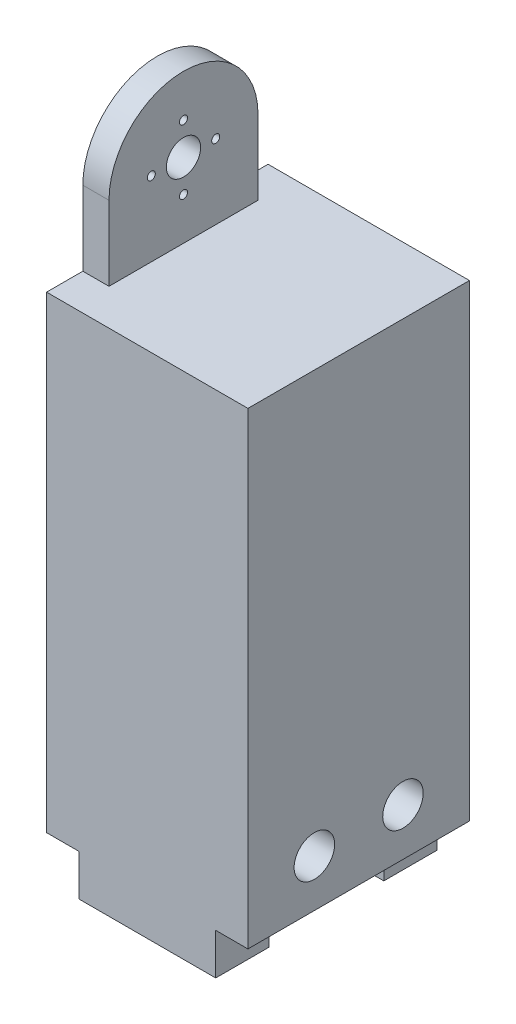
ISO-10303-21;
HEADER;
FILE_DESCRIPTION(('STEP AP214'),'2;1');
FILE_NAME('part.step','',(''),(''),'','','');
FILE_SCHEMA(('AUTOMOTIVE_DESIGN { 1 0 10303 214 1 1 1 1 }'));
ENDSEC;
DATA;
#1=APPLICATION_CONTEXT('core data for automotive mechanical design processes');
#2=APPLICATION_PROTOCOL_DEFINITION('international standard','automotive_design',2000,#1);
#3=PRODUCT_CONTEXT('',#1,'mechanical');
#4=PRODUCT('Part','Part','',(#3));
#5=PRODUCT_RELATED_PRODUCT_CATEGORY('part','',(#4));
#6=PRODUCT_DEFINITION_FORMATION('','',#4);
#7=PRODUCT_DEFINITION_CONTEXT('part definition',#1,'design');
#8=PRODUCT_DEFINITION('design','',#6,#7);
#9=PRODUCT_DEFINITION_SHAPE('','',#8);
#10=(LENGTH_UNIT() NAMED_UNIT(*) SI_UNIT(.MILLI.,.METRE.));
#11=(NAMED_UNIT(*) PLANE_ANGLE_UNIT() SI_UNIT($,.RADIAN.));
#12=(NAMED_UNIT(*) SI_UNIT($,.STERADIAN.) SOLID_ANGLE_UNIT());
#13=UNCERTAINTY_MEASURE_WITH_UNIT(LENGTH_MEASURE(1.E-05),#10,'distance_accuracy_value','');
#14=(GEOMETRIC_REPRESENTATION_CONTEXT(3) GLOBAL_UNCERTAINTY_ASSIGNED_CONTEXT((#13)) GLOBAL_UNIT_ASSIGNED_CONTEXT((#10,
#11,#12)) REPRESENTATION_CONTEXT('',''));
#15=CARTESIAN_POINT('',(0.,0.,0.));
#16=DIRECTION('',(0.,0.,1.));
#17=DIRECTION('',(1.,0.,0.));
#18=AXIS2_PLACEMENT_3D('',#15,#16,#17);
#19=CARTESIAN_POINT('',(-18.5,0.,-55.));
#20=DIRECTION('',(-1.,0.,0.));
#21=DIRECTION('',(0.,-1.,0.));
#22=AXIS2_PLACEMENT_3D('',#19,#20,#21);
#23=PLANE('',#22);
#24=CARTESIAN_POINT('',(-18.5,-25.,-27.5));
#25=DIRECTION('',(1.,0.,0.));
#26=DIRECTION('',(0.,1.,0.));
#27=AXIS2_PLACEMENT_3D('',#24,#25,#26);
#28=CIRCLE('',#27,4.25);
#29=CARTESIAN_POINT('',(-18.5,-20.75,-27.5));
#30=VERTEX_POINT('',#29);
#31=EDGE_CURVE('E262',#30,#30,#28,.F.);
#32=ORIENTED_EDGE('',*,*,#31,.T.);
#33=EDGE_LOOP('',(#32));
#34=FACE_BOUND('',#33,.T.);
#35=CARTESIAN_POINT('',(-18.5,-24.9999999999999,-35.5000000000001));
#36=DIRECTION('',(1.,0.,0.));
#37=DIRECTION('',(0.,1.,0.));
#38=AXIS2_PLACEMENT_3D('',#35,#36,#37);
#39=CIRCLE('',#38,1.);
#40=CARTESIAN_POINT('',(-18.5,-23.9999999999999,-35.5000000000001));
#41=VERTEX_POINT('',#40);
#42=EDGE_CURVE('E258',#41,#41,#39,.F.);
#43=ORIENTED_EDGE('',*,*,#42,.T.);
#44=EDGE_LOOP('',(#43));
#45=FACE_BOUND('',#44,.T.);
#46=CARTESIAN_POINT('',(-18.5,-25.,-19.5000000000001));
#47=DIRECTION('',(1.,0.,0.));
#48=DIRECTION('',(0.,1.,0.));
#49=AXIS2_PLACEMENT_3D('',#46,#47,#48);
#50=CIRCLE('',#49,1.);
#51=CARTESIAN_POINT('',(-18.5,-24.,-19.5000000000001));
#52=VERTEX_POINT('',#51);
#53=EDGE_CURVE('E254',#52,#52,#50,.F.);
#54=ORIENTED_EDGE('',*,*,#53,.T.);
#55=EDGE_LOOP('',(#54));
#56=FACE_BOUND('',#55,.T.);
#57=CARTESIAN_POINT('',(-18.5,-33.,-27.5000000000002));
#58=DIRECTION('',(1.,0.,0.));
#59=DIRECTION('',(0.,1.,0.));
#60=AXIS2_PLACEMENT_3D('',#57,#58,#59);
#61=CIRCLE('',#60,1.);
#62=CARTESIAN_POINT('',(-18.5,-32.,-27.5000000000002));
#63=VERTEX_POINT('',#62);
#64=EDGE_CURVE('E250',#63,#63,#61,.F.);
#65=ORIENTED_EDGE('',*,*,#64,.T.);
#66=EDGE_LOOP('',(#65));
#67=FACE_BOUND('',#66,.T.);
#68=CARTESIAN_POINT('',(-18.5,-17.,-27.5));
#69=DIRECTION('',(1.,0.,0.));
#70=DIRECTION('',(0.,1.,0.));
#71=AXIS2_PLACEMENT_3D('',#68,#69,#70);
#72=CIRCLE('',#71,1.);
#73=CARTESIAN_POINT('',(-18.5,-16.,-27.5));
#74=VERTEX_POINT('',#73);
#75=EDGE_CURVE('E241',#74,#74,#72,.F.);
#76=ORIENTED_EDGE('',*,*,#75,.T.);
#77=EDGE_LOOP('',(#76));
#78=FACE_BOUND('',#77,.T.);
#79=DIRECTION('',(0.,-1.,0.));
#80=VECTOR('',#79,1.);
#81=CARTESIAN_POINT('',(-18.5,0.,-9.00000000000001));
#82=LINE('',#81,#80);
#83=CARTESIAN_POINT('',(-18.5,-25.,-9.00000000000001));
#84=VERTEX_POINT('',#83);
#85=CARTESIAN_POINT('',(-18.5,-43.5,-9.00000000000001));
#86=VERTEX_POINT('',#85);
#87=EDGE_CURVE('E222',#84,#86,#82,.T.);
#88=ORIENTED_EDGE('',*,*,#87,.T.);
#89=DIRECTION('',(0.,0.,1.));
#90=VECTOR('',#89,1.);
#91=CARTESIAN_POINT('',(-18.5,-43.5,-55.));
#92=LINE('',#91,#90);
#93=CARTESIAN_POINT('',(-18.5,-43.5,-46.));
#94=VERTEX_POINT('',#93);
#95=EDGE_CURVE('E269',#94,#86,#92,.T.);
#96=ORIENTED_EDGE('',*,*,#95,.F.);
#97=DIRECTION('',(0.,-1.,0.));
#98=VECTOR('',#97,1.);
#99=CARTESIAN_POINT('',(-18.5,0.,-46.));
#100=LINE('',#99,#98);
#101=CARTESIAN_POINT('',(-18.5,-25.,-46.));
#102=VERTEX_POINT('',#101);
#103=EDGE_CURVE('E226',#102,#94,#100,.T.);
#104=ORIENTED_EDGE('',*,*,#103,.F.);
#105=CARTESIAN_POINT('',(-18.5,-25.,-27.5));
#106=DIRECTION('',(1.,0.,0.));
#107=DIRECTION('',(0.,1.,0.));
#108=AXIS2_PLACEMENT_3D('',#105,#106,#107);
#109=CIRCLE('',#108,18.5);
#110=EDGE_CURVE('E64',#102,#84,#109,.T.);
#111=ORIENTED_EDGE('',*,*,#110,.T.);
#112=EDGE_LOOP('',(#88,#96,#104,#111));
#113=FACE_BOUND('',#112,.T.);
#114=ADVANCED_FACE('F46',(#34,#45,#56,#67,#78,#113),#23,.F.);
#115=CARTESIAN_POINT('',(0.,0.,-55.));
#116=DIRECTION('',(0.,0.,1.));
#117=DIRECTION('',(1.,0.,0.));
#118=AXIS2_PLACEMENT_3D('',#115,#116,#117);
#119=PLANE('',#118);
#120=DIRECTION('',(0.,-1.,0.));
#121=VECTOR('',#120,1.);
#122=CARTESIAN_POINT('',(-25.,0.,-55.));
#123=LINE('',#122,#121);
#124=CARTESIAN_POINT('',(-25.,-43.5,-55.));
#125=VERTEX_POINT('',#124);
#126=CARTESIAN_POINT('',(-25.,-159.75,-55.));
#127=VERTEX_POINT('',#126);
#128=EDGE_CURVE('E56',#125,#127,#123,.T.);
#129=ORIENTED_EDGE('',*,*,#128,.F.);
#130=DIRECTION('',(-1.,0.,0.));
#131=VECTOR('',#130,1.);
#132=CARTESIAN_POINT('',(0.,-43.5,-55.));
#133=LINE('',#132,#131);
#134=CARTESIAN_POINT('',(25.,-43.5,-55.));
#135=VERTEX_POINT('',#134);
#136=EDGE_CURVE('E266',#135,#125,#133,.T.);
#137=ORIENTED_EDGE('',*,*,#136,.F.);
#138=DIRECTION('',(0.,1.,0.));
#139=VECTOR('',#138,1.);
#140=CARTESIAN_POINT('',(25.,0.,-55.));
#141=LINE('',#140,#139);
#142=CARTESIAN_POINT('',(25.,-159.75,-55.));
#143=VERTEX_POINT('',#142);
#144=EDGE_CURVE('E11',#143,#135,#141,.T.);
#145=ORIENTED_EDGE('',*,*,#144,.F.);
#146=DIRECTION('',(1.,0.,0.));
#147=VECTOR('',#146,1.);
#148=CARTESIAN_POINT('',(17.,-159.75,-55.));
#149=LINE('',#148,#147);
#150=CARTESIAN_POINT('',(17.,-159.75,-55.));
#151=VERTEX_POINT('',#150);
#152=EDGE_CURVE('E389',#151,#143,#149,.T.);
#153=ORIENTED_EDGE('',*,*,#152,.F.);
#154=DIRECTION('',(0.,1.,0.));
#155=VECTOR('',#154,1.);
#156=CARTESIAN_POINT('',(17.,-169.75,-55.));
#157=LINE('',#156,#155);
#158=CARTESIAN_POINT('',(17.,-170.,-55.));
#159=VERTEX_POINT('',#158);
#160=EDGE_CURVE('E377',#159,#151,#157,.T.);
#161=ORIENTED_EDGE('',*,*,#160,.F.);
#162=DIRECTION('',(1.,0.,0.));
#163=VECTOR('',#162,1.);
#164=CARTESIAN_POINT('',(0.,-170.,-55.));
#165=LINE('',#164,#163);
#166=CARTESIAN_POINT('',(-17.,-170.,-55.));
#167=VERTEX_POINT('',#166);
#168=EDGE_CURVE('E275',#167,#159,#165,.T.);
#169=ORIENTED_EDGE('',*,*,#168,.F.);
#170=DIRECTION('',(0.,1.,0.));
#171=VECTOR('',#170,1.);
#172=CARTESIAN_POINT('',(-17.,-169.75,-55.));
#173=LINE('',#172,#171);
#174=CARTESIAN_POINT('',(-17.,-159.75,-55.));
#175=VERTEX_POINT('',#174);
#176=EDGE_CURVE('E352',#167,#175,#173,.T.);
#177=ORIENTED_EDGE('',*,*,#176,.T.);
#178=DIRECTION('',(-1.,0.,0.));
#179=VECTOR('',#178,1.);
#180=CARTESIAN_POINT('',(-17.,-159.75,-55.));
#181=LINE('',#180,#179);
#182=EDGE_CURVE('E369',#175,#127,#181,.T.);
#183=ORIENTED_EDGE('',*,*,#182,.T.);
#184=EDGE_LOOP('',(#129,#137,#145,#153,#161,#169,#177,#183));
#185=FACE_BOUND('',#184,.T.);
#186=ADVANCED_FACE('F473',(#185),#119,.F.);
#187=CARTESIAN_POINT('',(0.,0.,0.));
#188=DIRECTION('',(0.,0.,1.));
#189=DIRECTION('',(1.,0.,0.));
#190=AXIS2_PLACEMENT_3D('',#187,#188,#189);
#191=PLANE('',#190);
#192=DIRECTION('',(-1.,0.,0.));
#193=VECTOR('',#192,1.);
#194=CARTESIAN_POINT('',(0.,-43.5,0.));
#195=LINE('',#194,#193);
#196=CARTESIAN_POINT('',(25.,-43.5,0.));
#197=VERTEX_POINT('',#196);
#198=CARTESIAN_POINT('',(-25.,-43.5,0.));
#199=VERTEX_POINT('',#198);
#200=EDGE_CURVE('E72',#197,#199,#195,.T.);
#201=ORIENTED_EDGE('',*,*,#200,.T.);
#202=DIRECTION('',(0.,-1.,0.));
#203=VECTOR('',#202,1.);
#204=CARTESIAN_POINT('',(-25.,0.,0.));
#205=LINE('',#204,#203);
#206=CARTESIAN_POINT('',(-25.,-159.75,0.));
#207=VERTEX_POINT('',#206);
#208=EDGE_CURVE('E456',#199,#207,#205,.T.);
#209=ORIENTED_EDGE('',*,*,#208,.T.);
#210=DIRECTION('',(-1.,0.,0.));
#211=VECTOR('',#210,1.);
#212=CARTESIAN_POINT('',(-17.,-159.75,0.));
#213=LINE('',#212,#211);
#214=CARTESIAN_POINT('',(-17.,-159.75,0.));
#215=VERTEX_POINT('',#214);
#216=EDGE_CURVE('E364',#215,#207,#213,.T.);
#217=ORIENTED_EDGE('',*,*,#216,.F.);
#218=DIRECTION('',(0.,-1.,0.));
#219=VECTOR('',#218,1.);
#220=CARTESIAN_POINT('',(-17.,-169.75,0.));
#221=LINE('',#220,#219);
#222=CARTESIAN_POINT('',(-17.,-170.,0.));
#223=VERTEX_POINT('',#222);
#224=EDGE_CURVE('E356',#215,#223,#221,.T.);
#225=ORIENTED_EDGE('',*,*,#224,.T.);
#226=DIRECTION('',(1.,0.,0.));
#227=VECTOR('',#226,1.);
#228=CARTESIAN_POINT('',(0.,-170.,0.));
#229=LINE('',#228,#227);
#230=CARTESIAN_POINT('',(17.,-170.,0.));
#231=VERTEX_POINT('',#230);
#232=EDGE_CURVE('E291',#223,#231,#229,.T.);
#233=ORIENTED_EDGE('',*,*,#232,.T.);
#234=DIRECTION('',(0.,-1.,0.));
#235=VECTOR('',#234,1.);
#236=CARTESIAN_POINT('',(17.,-169.75,0.));
#237=LINE('',#236,#235);
#238=CARTESIAN_POINT('',(17.,-159.75,0.));
#239=VERTEX_POINT('',#238);
#240=EDGE_CURVE('E385',#239,#231,#237,.T.);
#241=ORIENTED_EDGE('',*,*,#240,.F.);
#242=DIRECTION('',(1.,0.,0.));
#243=VECTOR('',#242,1.);
#244=CARTESIAN_POINT('',(17.,-159.75,0.));
#245=LINE('',#244,#243);
#246=CARTESIAN_POINT('',(25.,-159.75,0.));
#247=VERTEX_POINT('',#246);
#248=EDGE_CURVE('E392',#239,#247,#245,.T.);
#249=ORIENTED_EDGE('',*,*,#248,.T.);
#250=DIRECTION('',(0.,1.,0.));
#251=VECTOR('',#250,1.);
#252=CARTESIAN_POINT('',(25.,0.,0.));
#253=LINE('',#252,#251);
#254=EDGE_CURVE('E454',#247,#197,#253,.T.);
#255=ORIENTED_EDGE('',*,*,#254,.T.);
#256=EDGE_LOOP('',(#201,#209,#217,#225,#233,#241,#249,#255));
#257=FACE_BOUND('',#256,.T.);
#258=ADVANCED_FACE('F462',(#257),#191,.T.);
#259=CARTESIAN_POINT('',(25.,0.,-55.));
#260=DIRECTION('',(1.,0.,0.));
#261=DIRECTION('',(0.,1.,0.));
#262=AXIS2_PLACEMENT_3D('',#259,#260,#261);
#263=PLANE('',#262);
#264=CARTESIAN_POINT('',(25.,-148.,-38.5));
#265=DIRECTION('',(1.,0.,0.));
#266=DIRECTION('',(0.,1.,0.));
#267=AXIS2_PLACEMENT_3D('',#264,#265,#266);
#268=CIRCLE('',#267,5.03015904321146);
#269=CARTESIAN_POINT('',(25.,-142.969840956789,-38.5));
#270=VERTEX_POINT('',#269);
#271=EDGE_CURVE('E341',#270,#270,#268,.T.);
#272=ORIENTED_EDGE('',*,*,#271,.F.);
#273=EDGE_LOOP('',(#272));
#274=FACE_BOUND('',#273,.T.);
#275=CARTESIAN_POINT('',(25.,-148.,-16.5));
#276=DIRECTION('',(1.,0.,0.));
#277=DIRECTION('',(0.,1.,0.));
#278=AXIS2_PLACEMENT_3D('',#275,#276,#277);
#279=CIRCLE('',#278,5.03015904321146);
#280=CARTESIAN_POINT('',(25.,-142.969840956789,-16.5));
#281=VERTEX_POINT('',#280);
#282=EDGE_CURVE('E337',#281,#281,#279,.T.);
#283=ORIENTED_EDGE('',*,*,#282,.F.);
#284=EDGE_LOOP('',(#283));
#285=FACE_BOUND('',#284,.T.);
#286=ORIENTED_EDGE('',*,*,#144,.T.);
#287=DIRECTION('',(0.,0.,1.));
#288=VECTOR('',#287,1.);
#289=CARTESIAN_POINT('',(25.,-43.5,-55.));
#290=LINE('',#289,#288);
#291=EDGE_CURVE('E272',#135,#197,#290,.T.);
#292=ORIENTED_EDGE('',*,*,#291,.T.);
#293=ORIENTED_EDGE('',*,*,#254,.F.);
#294=DIRECTION('',(0.,0.,1.));
#295=VECTOR('',#294,1.);
#296=CARTESIAN_POINT('',(25.,-159.75,-55.));
#297=LINE('',#296,#295);
#298=EDGE_CURVE('E373',#143,#247,#297,.T.);
#299=ORIENTED_EDGE('',*,*,#298,.F.);
#300=EDGE_LOOP('',(#286,#292,#293,#299));
#301=FACE_BOUND('',#300,.T.);
#302=ADVANCED_FACE('F467',(#274,#285,#301),#263,.T.);
#303=CARTESIAN_POINT('',(-17.,0.,-55.));
#304=DIRECTION('',(1.,0.,0.));
#305=DIRECTION('',(0.,1.,0.));
#306=AXIS2_PLACEMENT_3D('',#303,#304,#305);
#307=PLANE('',#306);
#308=DIRECTION('',(0.,0.,1.));
#309=VECTOR('',#308,1.);
#310=CARTESIAN_POINT('',(-17.,-144.75,-55.));
#311=LINE('',#310,#309);
#312=CARTESIAN_POINT('',(-17.,-144.75,-34.6607292359092));
#313=VERTEX_POINT('',#312);
#314=CARTESIAN_POINT('',(-17.,-144.75,-20.3392707640907));
#315=VERTEX_POINT('',#314);
#316=EDGE_CURVE('E433',#313,#315,#311,.T.);
#317=ORIENTED_EDGE('',*,*,#316,.T.);
#318=CARTESIAN_POINT('',(-17.,-148.,-16.5));
#319=DIRECTION('',(1.,0.,0.));
#320=DIRECTION('',(0.,1.,0.));
#321=AXIS2_PLACEMENT_3D('',#318,#319,#320);
#322=CIRCLE('',#321,5.03015904321146);
#323=CARTESIAN_POINT('',(-17.,-151.839270764091,-13.25));
#324=VERTEX_POINT('',#323);
#325=EDGE_CURVE('E311',#324,#315,#322,.T.);
#326=ORIENTED_EDGE('',*,*,#325,.F.);
#327=DIRECTION('',(0.,1.,0.));
#328=VECTOR('',#327,1.);
#329=CARTESIAN_POINT('',(-17.,-169.75,-13.25));
#330=LINE('',#329,#328);
#331=CARTESIAN_POINT('',(-17.,-159.75,-13.25));
#332=VERTEX_POINT('',#331);
#333=EDGE_CURVE('E428',#332,#324,#330,.T.);
#334=ORIENTED_EDGE('',*,*,#333,.F.);
#335=DIRECTION('',(0.,0.,1.));
#336=VECTOR('',#335,1.);
#337=CARTESIAN_POINT('',(-17.,-159.75,-55.));
#338=LINE('',#337,#336);
#339=CARTESIAN_POINT('',(-17.,-159.75,-41.75));
#340=VERTEX_POINT('',#339);
#341=EDGE_CURVE('E365',#340,#332,#338,.T.);
#342=ORIENTED_EDGE('',*,*,#341,.F.);
#343=DIRECTION('',(0.,1.,0.));
#344=VECTOR('',#343,1.);
#345=CARTESIAN_POINT('',(-17.,-169.75,-41.75));
#346=LINE('',#345,#344);
#347=CARTESIAN_POINT('',(-17.,-151.839270764091,-41.75));
#348=VERTEX_POINT('',#347);
#349=EDGE_CURVE('E409',#340,#348,#346,.T.);
#350=ORIENTED_EDGE('',*,*,#349,.T.);
#351=CARTESIAN_POINT('',(-17.,-148.,-38.5));
#352=DIRECTION('',(1.,0.,0.));
#353=DIRECTION('',(0.,1.,0.));
#354=AXIS2_PLACEMENT_3D('',#351,#352,#353);
#355=CIRCLE('',#354,5.03015904321146);
#356=EDGE_CURVE('E321',#313,#348,#355,.T.);
#357=ORIENTED_EDGE('',*,*,#356,.F.);
#358=EDGE_LOOP('',(#317,#326,#334,#342,#350,#357));
#359=FACE_BOUND('',#358,.T.);
#360=ADVANCED_FACE('F525',(#359),#307,.T.);
#361=CARTESIAN_POINT('',(-25.,0.,-55.));
#362=DIRECTION('',(-1.,0.,0.));
#363=DIRECTION('',(0.,-1.,0.));
#364=AXIS2_PLACEMENT_3D('',#361,#362,#363);
#365=PLANE('',#364);
#366=DIRECTION('',(0.,0.,-1.));
#367=VECTOR('',#366,1.);
#368=CARTESIAN_POINT('',(-25.,-43.5,0.));
#369=LINE('',#368,#367);
#370=CARTESIAN_POINT('',(-25.,-43.5,-9.00000000000001));
#371=VERTEX_POINT('',#370);
#372=EDGE_CURVE('E231',#199,#371,#369,.T.);
#373=ORIENTED_EDGE('',*,*,#372,.T.);
#374=DIRECTION('',(0.,-1.,0.));
#375=VECTOR('',#374,1.);
#376=CARTESIAN_POINT('',(-25.,0.,-9.00000000000001));
#377=LINE('',#376,#375);
#378=CARTESIAN_POINT('',(-25.,-25.,-9.00000000000001));
#379=VERTEX_POINT('',#378);
#380=EDGE_CURVE('E207',#379,#371,#377,.T.);
#381=ORIENTED_EDGE('',*,*,#380,.F.);
#382=CARTESIAN_POINT('',(-25.,-25.,-27.5));
#383=DIRECTION('',(1.,0.,0.));
#384=DIRECTION('',(0.,1.,0.));
#385=AXIS2_PLACEMENT_3D('',#382,#383,#384);
#386=CIRCLE('',#385,18.5);
#387=CARTESIAN_POINT('',(-25.,-25.,-46.));
#388=VERTEX_POINT('',#387);
#389=EDGE_CURVE('E200',#388,#379,#386,.T.);
#390=ORIENTED_EDGE('',*,*,#389,.F.);
#391=DIRECTION('',(0.,-1.,0.));
#392=VECTOR('',#391,1.);
#393=CARTESIAN_POINT('',(-25.,0.,-46.));
#394=LINE('',#393,#392);
#395=CARTESIAN_POINT('',(-25.,-43.5,-46.));
#396=VERTEX_POINT('',#395);
#397=EDGE_CURVE('E210',#388,#396,#394,.T.);
#398=ORIENTED_EDGE('',*,*,#397,.T.);
#399=EDGE_CURVE('E216',#396,#125,#369,.T.);
#400=ORIENTED_EDGE('',*,*,#399,.T.);
#401=ORIENTED_EDGE('',*,*,#128,.T.);
#402=DIRECTION('',(0.,0.,1.));
#403=VECTOR('',#402,1.);
#404=CARTESIAN_POINT('',(-25.,-159.75,-55.));
#405=LINE('',#404,#403);
#406=EDGE_CURVE('E351',#127,#207,#405,.T.);
#407=ORIENTED_EDGE('',*,*,#406,.T.);
#408=ORIENTED_EDGE('',*,*,#208,.F.);
#409=EDGE_LOOP('',(#373,#381,#390,#398,#400,#401,#407,#408));
#410=FACE_BOUND('',#409,.T.);
#411=CARTESIAN_POINT('',(-25.,-148.,-16.5));
#412=DIRECTION('',(1.,0.,0.));
#413=DIRECTION('',(0.,1.,0.));
#414=AXIS2_PLACEMENT_3D('',#411,#412,#413);
#415=CIRCLE('',#414,5.03015904321146);
#416=CARTESIAN_POINT('',(-25.,-142.969840956789,-16.5));
#417=VERTEX_POINT('',#416);
#418=EDGE_CURVE('E317',#417,#417,#415,.T.);
#419=ORIENTED_EDGE('',*,*,#418,.T.);
#420=EDGE_LOOP('',(#419));
#421=FACE_BOUND('',#420,.T.);
#422=CARTESIAN_POINT('',(-25.,-148.,-38.5));
#423=DIRECTION('',(1.,0.,0.));
#424=DIRECTION('',(0.,1.,0.));
#425=AXIS2_PLACEMENT_3D('',#422,#423,#424);
#426=CIRCLE('',#425,5.03015904321146);
#427=CARTESIAN_POINT('',(-25.,-142.969840956789,-38.5));
#428=VERTEX_POINT('',#427);
#429=EDGE_CURVE('E307',#428,#428,#426,.T.);
#430=ORIENTED_EDGE('',*,*,#429,.T.);
#431=EDGE_LOOP('',(#430));
#432=FACE_BOUND('',#431,.T.);
#433=CARTESIAN_POINT('',(-25.,-17.,-27.5));
#434=DIRECTION('',(-1.,0.,0.));
#435=DIRECTION('',(0.,-1.,0.));
#436=AXIS2_PLACEMENT_3D('',#433,#434,#435);
#437=CIRCLE('',#436,1.);
#438=CARTESIAN_POINT('',(-25.,-18.,-27.5));
#439=VERTEX_POINT('',#438);
#440=EDGE_CURVE('E449',#439,#439,#437,.T.);
#441=ORIENTED_EDGE('',*,*,#440,.F.);
#442=EDGE_LOOP('',(#441));
#443=FACE_BOUND('',#442,.T.);
#444=CARTESIAN_POINT('',(-25.,-25.,-27.5));
#445=DIRECTION('',(-1.,0.,0.));
#446=DIRECTION('',(0.,-1.,0.));
#447=AXIS2_PLACEMENT_3D('',#444,#445,#446);
#448=CIRCLE('',#447,4.25);
#449=CARTESIAN_POINT('',(-25.,-29.25,-27.5));
#450=VERTEX_POINT('',#449);
#451=EDGE_CURVE('E50',#450,#450,#448,.T.);
#452=ORIENTED_EDGE('',*,*,#451,.F.);
#453=EDGE_LOOP('',(#452));
#454=FACE_BOUND('',#453,.T.);
#455=CARTESIAN_POINT('',(-25.,-24.9999999999999,-35.5000000000001));
#456=DIRECTION('',(-1.,0.,0.));
#457=DIRECTION('',(0.,-1.,0.));
#458=AXIS2_PLACEMENT_3D('',#455,#456,#457);
#459=CIRCLE('',#458,1.);
#460=CARTESIAN_POINT('',(-25.,-25.9999999999999,-35.5000000000001));
#461=VERTEX_POINT('',#460);
#462=EDGE_CURVE('E445',#461,#461,#459,.T.);
#463=ORIENTED_EDGE('',*,*,#462,.F.);
#464=EDGE_LOOP('',(#463));
#465=FACE_BOUND('',#464,.T.);
#466=CARTESIAN_POINT('',(-25.,-33.,-27.5000000000002));
#467=DIRECTION('',(-1.,0.,0.));
#468=DIRECTION('',(0.,-1.,0.));
#469=AXIS2_PLACEMENT_3D('',#466,#467,#468);
#470=CIRCLE('',#469,1.);
#471=CARTESIAN_POINT('',(-25.,-34.,-27.5000000000002));
#472=VERTEX_POINT('',#471);
#473=EDGE_CURVE('E441',#472,#472,#470,.T.);
#474=ORIENTED_EDGE('',*,*,#473,.F.);
#475=EDGE_LOOP('',(#474));
#476=FACE_BOUND('',#475,.T.);
#477=CARTESIAN_POINT('',(-25.,-25.,-19.5000000000001));
#478=DIRECTION('',(-1.,0.,0.));
#479=DIRECTION('',(0.,-1.,0.));
#480=AXIS2_PLACEMENT_3D('',#477,#478,#479);
#481=CIRCLE('',#480,1.);
#482=CARTESIAN_POINT('',(-25.,-26.,-19.5000000000001));
#483=VERTEX_POINT('',#482);
#484=EDGE_CURVE('E432',#483,#483,#481,.T.);
#485=ORIENTED_EDGE('',*,*,#484,.F.);
#486=EDGE_LOOP('',(#485));
#487=FACE_BOUND('',#486,.T.);
#488=ADVANCED_FACE('F48',(#410,#421,#432,#443,#454,#465,#476,#487),#365,.T.);
#489=CARTESIAN_POINT('',(0.,-144.75,-55.));
#490=DIRECTION('',(0.,1.,0.));
#491=DIRECTION('',(0.,0.,1.));
#492=AXIS2_PLACEMENT_3D('',#489,#490,#491);
#493=PLANE('',#492);
#494=DIRECTION('',(-1.,0.,0.));
#495=VECTOR('',#494,1.);
#496=CARTESIAN_POINT('',(-17.,-144.75,-41.75));
#497=LINE('',#496,#495);
#498=CARTESIAN_POINT('',(17.,-144.75,-41.75));
#499=VERTEX_POINT('',#498);
#500=CARTESIAN_POINT('',(-17.,-144.75,-41.75));
#501=VERTEX_POINT('',#500);
#502=EDGE_CURVE('E408',#499,#501,#497,.T.);
#503=ORIENTED_EDGE('',*,*,#502,.F.);
#504=DIRECTION('',(0.,0.,1.));
#505=VECTOR('',#504,1.);
#506=CARTESIAN_POINT('',(17.,-144.75,-55.));
#507=LINE('',#506,#505);
#508=CARTESIAN_POINT('',(17.,-144.75,-34.6607292359092));
#509=VERTEX_POINT('',#508);
#510=EDGE_CURVE('E434',#499,#509,#507,.T.);
#511=ORIENTED_EDGE('',*,*,#510,.T.);
#512=CARTESIAN_POINT('',(17.,-144.75,-20.3392707640907));
#513=VERTEX_POINT('',#512);
#514=EDGE_CURVE('E427',#509,#513,#507,.T.);
#515=ORIENTED_EDGE('',*,*,#514,.T.);
#516=DIRECTION('',(0.,0.,-1.));
#517=VECTOR('',#516,1.);
#518=CARTESIAN_POINT('',(17.,-144.75,-55.));
#519=LINE('',#518,#517);
#520=CARTESIAN_POINT('',(17.,-144.75,-13.25));
#521=VERTEX_POINT('',#520);
#522=EDGE_CURVE('E335',#521,#513,#519,.T.);
#523=ORIENTED_EDGE('',*,*,#522,.F.);
#524=DIRECTION('',(1.,0.,0.));
#525=VECTOR('',#524,1.);
#526=CARTESIAN_POINT('',(-17.,-144.75,-13.25));
#527=LINE('',#526,#525);
#528=CARTESIAN_POINT('',(-17.,-144.75,-13.25));
#529=VERTEX_POINT('',#528);
#530=EDGE_CURVE('E413',#529,#521,#527,.T.);
#531=ORIENTED_EDGE('',*,*,#530,.F.);
#532=DIRECTION('',(0.,0.,1.));
#533=VECTOR('',#532,1.);
#534=CARTESIAN_POINT('',(-17.,-144.75,-55.));
#535=LINE('',#534,#533);
#536=EDGE_CURVE('E315',#315,#529,#535,.T.);
#537=ORIENTED_EDGE('',*,*,#536,.F.);
#538=ORIENTED_EDGE('',*,*,#316,.F.);
#539=EDGE_CURVE('E429',#501,#313,#311,.T.);
#540=ORIENTED_EDGE('',*,*,#539,.F.);
#541=EDGE_LOOP('',(#503,#511,#515,#523,#531,#537,#538,#540));
#542=FACE_BOUND('',#541,.T.);
#543=ADVANCED_FACE('F524',(#542),#493,.F.);
#544=CARTESIAN_POINT('',(17.,0.,-55.));
#545=DIRECTION('',(1.,0.,0.));
#546=DIRECTION('',(0.,0.,-1.));
#547=AXIS2_PLACEMENT_3D('',#544,#545,#546);
#548=PLANE('',#547);
#549=DIRECTION('',(0.,1.,0.));
#550=VECTOR('',#549,1.);
#551=CARTESIAN_POINT('',(17.,-169.75,-13.25));
#552=LINE('',#551,#550);
#553=CARTESIAN_POINT('',(17.,-159.75,-13.25));
#554=VERTEX_POINT('',#553);
#555=CARTESIAN_POINT('',(17.,-151.839270764091,-13.25));
#556=VERTEX_POINT('',#555);
#557=EDGE_CURVE('E422',#554,#556,#552,.T.);
#558=ORIENTED_EDGE('',*,*,#557,.T.);
#559=CARTESIAN_POINT('',(17.,-148.,-16.5));
#560=DIRECTION('',(1.,0.,0.));
#561=DIRECTION('',(0.,1.,0.));
#562=AXIS2_PLACEMENT_3D('',#559,#560,#561);
#563=CIRCLE('',#562,5.03015904321146);
#564=EDGE_CURVE('E331',#556,#513,#563,.T.);
#565=ORIENTED_EDGE('',*,*,#564,.T.);
#566=ORIENTED_EDGE('',*,*,#514,.F.);
#567=CARTESIAN_POINT('',(17.,-148.,-38.5));
#568=DIRECTION('',(1.,0.,0.));
#569=DIRECTION('',(0.,1.,0.));
#570=AXIS2_PLACEMENT_3D('',#567,#568,#569);
#571=CIRCLE('',#570,5.03015904321146);
#572=CARTESIAN_POINT('',(17.,-151.839270764091,-41.75));
#573=VERTEX_POINT('',#572);
#574=EDGE_CURVE('E345',#509,#573,#571,.T.);
#575=ORIENTED_EDGE('',*,*,#574,.T.);
#576=DIRECTION('',(0.,1.,0.));
#577=VECTOR('',#576,1.);
#578=CARTESIAN_POINT('',(17.,-169.75,-41.75));
#579=LINE('',#578,#577);
#580=CARTESIAN_POINT('',(17.,-159.75,-41.75));
#581=VERTEX_POINT('',#580);
#582=EDGE_CURVE('E404',#581,#573,#579,.T.);
#583=ORIENTED_EDGE('',*,*,#582,.F.);
#584=DIRECTION('',(0.,0.,1.));
#585=VECTOR('',#584,1.);
#586=CARTESIAN_POINT('',(17.,-159.75,-55.));
#587=LINE('',#586,#585);
#588=EDGE_CURVE('E386',#581,#554,#587,.T.);
#589=ORIENTED_EDGE('',*,*,#588,.T.);
#590=EDGE_LOOP('',(#558,#565,#566,#575,#583,#589));
#591=FACE_BOUND('',#590,.T.);
#592=ADVANCED_FACE('F536',(#591),#548,.F.);
#593=CARTESIAN_POINT('',(-30.,-25.,-19.5000000000001));
#594=DIRECTION('',(1.,0.,0.));
#595=DIRECTION('',(0.,1.,0.));
#596=AXIS2_PLACEMENT_3D('',#593,#594,#595);
#597=CYLINDRICAL_SURFACE('',#596,1.);
#598=ORIENTED_EDGE('',*,*,#484,.T.);
#599=EDGE_LOOP('',(#598));
#600=FACE_BOUND('',#599,.T.);
#601=ORIENTED_EDGE('',*,*,#53,.F.);
#602=EDGE_LOOP('',(#601));
#603=FACE_BOUND('',#602,.T.);
#604=ADVANCED_FACE('F532',(#600,#603),#597,.F.);
#605=CARTESIAN_POINT('',(-30.,-33.,-27.5000000000002));
#606=DIRECTION('',(1.,0.,0.));
#607=DIRECTION('',(0.,1.,0.));
#608=AXIS2_PLACEMENT_3D('',#605,#606,#607);
#609=CYLINDRICAL_SURFACE('',#608,1.);
#610=ORIENTED_EDGE('',*,*,#473,.T.);
#611=EDGE_LOOP('',(#610));
#612=FACE_BOUND('',#611,.T.);
#613=ORIENTED_EDGE('',*,*,#64,.F.);
#614=EDGE_LOOP('',(#613));
#615=FACE_BOUND('',#614,.T.);
#616=ADVANCED_FACE('F535',(#612,#615),#609,.F.);
#617=CARTESIAN_POINT('',(-30.,-24.9999999999999,-35.5000000000001));
#618=DIRECTION('',(1.,0.,0.));
#619=DIRECTION('',(0.,1.,0.));
#620=AXIS2_PLACEMENT_3D('',#617,#618,#619);
#621=CYLINDRICAL_SURFACE('',#620,1.);
#622=ORIENTED_EDGE('',*,*,#462,.T.);
#623=EDGE_LOOP('',(#622));
#624=FACE_BOUND('',#623,.T.);
#625=ORIENTED_EDGE('',*,*,#42,.F.);
#626=EDGE_LOOP('',(#625));
#627=FACE_BOUND('',#626,.T.);
#628=ADVANCED_FACE('F638',(#624,#627),#621,.F.);
#629=CARTESIAN_POINT('',(-30.,-17.,-27.5));
#630=DIRECTION('',(1.,0.,0.));
#631=DIRECTION('',(0.,1.,0.));
#632=AXIS2_PLACEMENT_3D('',#629,#630,#631);
#633=CYLINDRICAL_SURFACE('',#632,1.);
#634=ORIENTED_EDGE('',*,*,#440,.T.);
#635=EDGE_LOOP('',(#634));
#636=FACE_BOUND('',#635,.T.);
#637=ORIENTED_EDGE('',*,*,#75,.F.);
#638=EDGE_LOOP('',(#637));
#639=FACE_BOUND('',#638,.T.);
#640=ADVANCED_FACE('F635',(#636,#639),#633,.F.);
#641=CARTESIAN_POINT('',(-30.,-25.,-27.5));
#642=DIRECTION('',(1.,0.,0.));
#643=DIRECTION('',(0.,1.,0.));
#644=AXIS2_PLACEMENT_3D('',#641,#642,#643);
#645=CYLINDRICAL_SURFACE('',#644,4.25);
#646=ORIENTED_EDGE('',*,*,#451,.T.);
#647=EDGE_LOOP('',(#646));
#648=FACE_BOUND('',#647,.T.);
#649=ORIENTED_EDGE('',*,*,#31,.F.);
#650=EDGE_LOOP('',(#649));
#651=FACE_BOUND('',#650,.T.);
#652=ADVANCED_FACE('F519',(#648,#651),#645,.F.);
#653=CARTESIAN_POINT('',(-17.,-169.75,-13.25));
#654=DIRECTION('',(0.,0.,1.));
#655=DIRECTION('',(1.,0.,0.));
#656=AXIS2_PLACEMENT_3D('',#653,#654,#655);
#657=PLANE('',#656);
#658=ORIENTED_EDGE('',*,*,#530,.T.);
#659=EDGE_CURVE('E417',#556,#521,#552,.T.);
#660=ORIENTED_EDGE('',*,*,#659,.F.);
#661=ORIENTED_EDGE('',*,*,#557,.F.);
#662=CARTESIAN_POINT('',(17.,-170.,-13.25));
#663=VERTEX_POINT('',#662);
#664=EDGE_CURVE('E418',#663,#554,#552,.T.);
#665=ORIENTED_EDGE('',*,*,#664,.F.);
#666=DIRECTION('',(1.,0.,0.));
#667=VECTOR('',#666,1.);
#668=CARTESIAN_POINT('',(0.,-170.,-13.25));
#669=LINE('',#668,#667);
#670=CARTESIAN_POINT('',(-17.,-170.,-13.25));
#671=VERTEX_POINT('',#670);
#672=EDGE_CURVE('E295',#671,#663,#669,.T.);
#673=ORIENTED_EDGE('',*,*,#672,.F.);
#674=EDGE_CURVE('E423',#671,#332,#330,.T.);
#675=ORIENTED_EDGE('',*,*,#674,.T.);
#676=ORIENTED_EDGE('',*,*,#333,.T.);
#677=EDGE_CURVE('E421',#324,#529,#330,.T.);
#678=ORIENTED_EDGE('',*,*,#677,.T.);
#679=EDGE_LOOP('',(#658,#660,#661,#665,#673,#675,#676,#678));
#680=FACE_BOUND('',#679,.T.);
#681=ADVANCED_FACE('F621',(#680),#657,.F.);
#682=CARTESIAN_POINT('',(-17.,-169.75,-41.75));
#683=DIRECTION('',(0.,0.,-1.));
#684=DIRECTION('',(-1.,0.,0.));
#685=AXIS2_PLACEMENT_3D('',#682,#683,#684);
#686=PLANE('',#685);
#687=ORIENTED_EDGE('',*,*,#502,.T.);
#688=EDGE_CURVE('E403',#348,#501,#346,.T.);
#689=ORIENTED_EDGE('',*,*,#688,.F.);
#690=ORIENTED_EDGE('',*,*,#349,.F.);
#691=CARTESIAN_POINT('',(-17.,-170.,-41.75));
#692=VERTEX_POINT('',#691);
#693=EDGE_CURVE('E405',#692,#340,#346,.T.);
#694=ORIENTED_EDGE('',*,*,#693,.F.);
#695=DIRECTION('',(1.,0.,0.));
#696=VECTOR('',#695,1.);
#697=CARTESIAN_POINT('',(0.,-170.,-41.75));
#698=LINE('',#697,#696);
#699=CARTESIAN_POINT('',(17.,-170.,-41.75));
#700=VERTEX_POINT('',#699);
#701=EDGE_CURVE('E279',#692,#700,#698,.T.);
#702=ORIENTED_EDGE('',*,*,#701,.T.);
#703=EDGE_CURVE('E399',#700,#581,#579,.T.);
#704=ORIENTED_EDGE('',*,*,#703,.T.);
#705=ORIENTED_EDGE('',*,*,#582,.T.);
#706=EDGE_CURVE('E396',#573,#499,#579,.T.);
#707=ORIENTED_EDGE('',*,*,#706,.T.);
#708=EDGE_LOOP('',(#687,#689,#690,#694,#702,#704,#705,#707));
#709=FACE_BOUND('',#708,.T.);
#710=ADVANCED_FACE('F614',(#709),#686,.F.);
#711=CARTESIAN_POINT('',(17.,0.,0.));
#712=DIRECTION('',(1.,0.,0.));
#713=DIRECTION('',(0.,1.,0.));
#714=AXIS2_PLACEMENT_3D('',#711,#712,#713);
#715=PLANE('',#714);
#716=ORIENTED_EDGE('',*,*,#664,.T.);
#717=EDGE_CURVE('E381',#554,#239,#587,.T.);
#718=ORIENTED_EDGE('',*,*,#717,.T.);
#719=ORIENTED_EDGE('',*,*,#240,.T.);
#720=DIRECTION('',(0.,0.,1.));
#721=VECTOR('',#720,1.);
#722=CARTESIAN_POINT('',(17.,-170.,-13.25));
#723=LINE('',#722,#721);
#724=EDGE_CURVE('E303',#663,#231,#723,.T.);
#725=ORIENTED_EDGE('',*,*,#724,.F.);
#726=EDGE_LOOP('',(#716,#718,#719,#725));
#727=FACE_BOUND('',#726,.T.);
#728=ADVANCED_FACE('F610',(#727),#715,.T.);
#729=ORIENTED_EDGE('',*,*,#703,.F.);
#730=DIRECTION('',(0.,0.,-1.));
#731=VECTOR('',#730,1.);
#732=CARTESIAN_POINT('',(17.,-170.,-41.75));
#733=LINE('',#732,#731);
#734=EDGE_CURVE('E283',#700,#159,#733,.T.);
#735=ORIENTED_EDGE('',*,*,#734,.T.);
#736=ORIENTED_EDGE('',*,*,#160,.T.);
#737=EDGE_CURVE('E382',#151,#581,#587,.T.);
#738=ORIENTED_EDGE('',*,*,#737,.T.);
#739=EDGE_LOOP('',(#729,#735,#736,#738));
#740=FACE_BOUND('',#739,.T.);
#741=ADVANCED_FACE('F613',(#740),#715,.T.);
#742=CARTESIAN_POINT('',(17.,-159.75,-55.));
#743=DIRECTION('',(0.,1.,0.));
#744=DIRECTION('',(-1.,0.,0.));
#745=AXIS2_PLACEMENT_3D('',#742,#743,#744);
#746=PLANE('',#745);
#747=ORIENTED_EDGE('',*,*,#298,.T.);
#748=ORIENTED_EDGE('',*,*,#248,.F.);
#749=ORIENTED_EDGE('',*,*,#717,.F.);
#750=ORIENTED_EDGE('',*,*,#588,.F.);
#751=ORIENTED_EDGE('',*,*,#737,.F.);
#752=ORIENTED_EDGE('',*,*,#152,.T.);
#753=EDGE_LOOP('',(#747,#748,#749,#750,#751,#752));
#754=FACE_BOUND('',#753,.T.);
#755=ADVANCED_FACE('F606',(#754),#746,.F.);
#756=CARTESIAN_POINT('',(-17.,0.,0.));
#757=DIRECTION('',(-1.,0.,0.));
#758=DIRECTION('',(0.,1.,0.));
#759=AXIS2_PLACEMENT_3D('',#756,#757,#758);
#760=PLANE('',#759);
#761=ORIENTED_EDGE('',*,*,#674,.F.);
#762=DIRECTION('',(0.,0.,1.));
#763=VECTOR('',#762,1.);
#764=CARTESIAN_POINT('',(-17.,-170.,-13.25));
#765=LINE('',#764,#763);
#766=EDGE_CURVE('E299',#671,#223,#765,.T.);
#767=ORIENTED_EDGE('',*,*,#766,.T.);
#768=ORIENTED_EDGE('',*,*,#224,.F.);
#769=EDGE_CURVE('E359',#332,#215,#338,.T.);
#770=ORIENTED_EDGE('',*,*,#769,.F.);
#771=EDGE_LOOP('',(#761,#767,#768,#770));
#772=FACE_BOUND('',#771,.T.);
#773=ADVANCED_FACE('F602',(#772),#760,.T.);
#774=ORIENTED_EDGE('',*,*,#693,.T.);
#775=EDGE_CURVE('E360',#175,#340,#338,.T.);
#776=ORIENTED_EDGE('',*,*,#775,.F.);
#777=ORIENTED_EDGE('',*,*,#176,.F.);
#778=DIRECTION('',(0.,0.,-1.));
#779=VECTOR('',#778,1.);
#780=CARTESIAN_POINT('',(-17.,-170.,-41.75));
#781=LINE('',#780,#779);
#782=EDGE_CURVE('E287',#692,#167,#781,.T.);
#783=ORIENTED_EDGE('',*,*,#782,.F.);
#784=EDGE_LOOP('',(#774,#776,#777,#783));
#785=FACE_BOUND('',#784,.T.);
#786=ADVANCED_FACE('F605',(#785),#760,.T.);
#787=CARTESIAN_POINT('',(-17.,-159.75,-55.));
#788=DIRECTION('',(0.,-1.,0.));
#789=DIRECTION('',(1.,0.,0.));
#790=AXIS2_PLACEMENT_3D('',#787,#788,#789);
#791=PLANE('',#790);
#792=ORIENTED_EDGE('',*,*,#406,.F.);
#793=ORIENTED_EDGE('',*,*,#182,.F.);
#794=ORIENTED_EDGE('',*,*,#775,.T.);
#795=ORIENTED_EDGE('',*,*,#341,.T.);
#796=ORIENTED_EDGE('',*,*,#769,.T.);
#797=ORIENTED_EDGE('',*,*,#216,.T.);
#798=EDGE_LOOP('',(#792,#793,#794,#795,#796,#797));
#799=FACE_BOUND('',#798,.T.);
#800=ADVANCED_FACE('F479',(#799),#791,.T.);
#801=CARTESIAN_POINT('',(17.,-148.,-38.5));
#802=DIRECTION('',(1.,0.,0.));
#803=DIRECTION('',(0.,1.,0.));
#804=AXIS2_PLACEMENT_3D('',#801,#802,#803);
#805=PLANE('',#804);
#806=ORIENTED_EDGE('',*,*,#510,.F.);
#807=ORIENTED_EDGE('',*,*,#706,.F.);
#808=EDGE_CURVE('E330',#573,#509,#571,.T.);
#809=ORIENTED_EDGE('',*,*,#808,.T.);
#810=EDGE_LOOP('',(#806,#807,#809));
#811=FACE_BOUND('',#810,.T.);
#812=ADVANCED_FACE('F597',(#811),#805,.T.);
#813=CARTESIAN_POINT('',(17.,-148.,-38.5));
#814=DIRECTION('',(1.,0.,0.));
#815=DIRECTION('',(0.,1.,0.));
#816=AXIS2_PLACEMENT_3D('',#813,#814,#815);
#817=CYLINDRICAL_SURFACE('',#816,5.03015904321146);
#818=ORIENTED_EDGE('',*,*,#574,.F.);
#819=ORIENTED_EDGE('',*,*,#808,.F.);
#820=EDGE_LOOP('',(#818,#819));
#821=FACE_BOUND('',#820,.T.);
#822=ORIENTED_EDGE('',*,*,#271,.T.);
#823=EDGE_LOOP('',(#822));
#824=FACE_BOUND('',#823,.T.);
#825=ADVANCED_FACE('F590',(#821,#824),#817,.F.);
#826=CARTESIAN_POINT('',(17.,-148.,-16.5));
#827=DIRECTION('',(1.,0.,0.));
#828=DIRECTION('',(0.,1.,0.));
#829=AXIS2_PLACEMENT_3D('',#826,#827,#828);
#830=PLANE('',#829);
#831=ORIENTED_EDGE('',*,*,#522,.T.);
#832=EDGE_CURVE('E336',#513,#556,#563,.T.);
#833=ORIENTED_EDGE('',*,*,#832,.T.);
#834=ORIENTED_EDGE('',*,*,#659,.T.);
#835=EDGE_LOOP('',(#831,#833,#834));
#836=FACE_BOUND('',#835,.T.);
#837=ADVANCED_FACE('F587',(#836),#830,.T.);
#838=CARTESIAN_POINT('',(17.,-148.,-16.5));
#839=DIRECTION('',(1.,0.,0.));
#840=DIRECTION('',(0.,1.,0.));
#841=AXIS2_PLACEMENT_3D('',#838,#839,#840);
#842=CYLINDRICAL_SURFACE('',#841,5.03015904321146);
#843=ORIENTED_EDGE('',*,*,#564,.F.);
#844=ORIENTED_EDGE('',*,*,#832,.F.);
#845=EDGE_LOOP('',(#843,#844));
#846=FACE_BOUND('',#845,.T.);
#847=ORIENTED_EDGE('',*,*,#282,.T.);
#848=EDGE_LOOP('',(#847));
#849=FACE_BOUND('',#848,.T.);
#850=ADVANCED_FACE('F582',(#846,#849),#842,.F.);
#851=CARTESIAN_POINT('',(-17.,-148.,-38.5));
#852=DIRECTION('',(-1.,0.,0.));
#853=DIRECTION('',(0.,1.,0.));
#854=AXIS2_PLACEMENT_3D('',#851,#852,#853);
#855=PLANE('',#854);
#856=ORIENTED_EDGE('',*,*,#539,.T.);
#857=EDGE_CURVE('E324',#348,#313,#355,.T.);
#858=ORIENTED_EDGE('',*,*,#857,.F.);
#859=ORIENTED_EDGE('',*,*,#688,.T.);
#860=EDGE_LOOP('',(#856,#858,#859));
#861=FACE_BOUND('',#860,.T.);
#862=ADVANCED_FACE('F579',(#861),#855,.T.);
#863=CARTESIAN_POINT('',(-17.,-148.,-38.5));
#864=DIRECTION('',(-1.,0.,0.));
#865=DIRECTION('',(0.,-1.,0.));
#866=AXIS2_PLACEMENT_3D('',#863,#864,#865);
#867=CYLINDRICAL_SURFACE('',#866,5.03015904321146);
#868=ORIENTED_EDGE('',*,*,#356,.T.);
#869=ORIENTED_EDGE('',*,*,#857,.T.);
#870=EDGE_LOOP('',(#868,#869));
#871=FACE_BOUND('',#870,.T.);
#872=ORIENTED_EDGE('',*,*,#429,.F.);
#873=EDGE_LOOP('',(#872));
#874=FACE_BOUND('',#873,.T.);
#875=ADVANCED_FACE('F574',(#871,#874),#867,.F.);
#876=CARTESIAN_POINT('',(-17.,-148.,-16.5));
#877=DIRECTION('',(-1.,0.,0.));
#878=DIRECTION('',(0.,1.,0.));
#879=AXIS2_PLACEMENT_3D('',#876,#877,#878);
#880=PLANE('',#879);
#881=ORIENTED_EDGE('',*,*,#536,.T.);
#882=ORIENTED_EDGE('',*,*,#677,.F.);
#883=EDGE_CURVE('E316',#315,#324,#322,.T.);
#884=ORIENTED_EDGE('',*,*,#883,.F.);
#885=EDGE_LOOP('',(#881,#882,#884));
#886=FACE_BOUND('',#885,.T.);
#887=ADVANCED_FACE('F571',(#886),#880,.T.);
#888=CARTESIAN_POINT('',(-17.,-148.,-16.5));
#889=DIRECTION('',(-1.,0.,0.));
#890=DIRECTION('',(0.,-1.,0.));
#891=AXIS2_PLACEMENT_3D('',#888,#889,#890);
#892=CYLINDRICAL_SURFACE('',#891,5.03015904321146);
#893=ORIENTED_EDGE('',*,*,#325,.T.);
#894=ORIENTED_EDGE('',*,*,#883,.T.);
#895=EDGE_LOOP('',(#893,#894));
#896=FACE_BOUND('',#895,.T.);
#897=ORIENTED_EDGE('',*,*,#418,.F.);
#898=EDGE_LOOP('',(#897));
#899=FACE_BOUND('',#898,.T.);
#900=ADVANCED_FACE('F569',(#896,#899),#892,.F.);
#901=CARTESIAN_POINT('',(0.,-170.,-13.25));
#902=DIRECTION('',(0.,-1.,0.));
#903=DIRECTION('',(0.,0.,-1.));
#904=AXIS2_PLACEMENT_3D('',#901,#902,#903);
#905=PLANE('',#904);
#906=ORIENTED_EDGE('',*,*,#232,.F.);
#907=ORIENTED_EDGE('',*,*,#766,.F.);
#908=ORIENTED_EDGE('',*,*,#672,.T.);
#909=ORIENTED_EDGE('',*,*,#724,.T.);
#910=EDGE_LOOP('',(#906,#907,#908,#909));
#911=FACE_BOUND('',#910,.T.);
#912=ADVANCED_FACE('F565',(#911),#905,.T.);
#913=CARTESIAN_POINT('',(0.,-170.,-41.75));
#914=DIRECTION('',(0.,1.,0.));
#915=DIRECTION('',(0.,0.,1.));
#916=AXIS2_PLACEMENT_3D('',#913,#914,#915);
#917=PLANE('',#916);
#918=ORIENTED_EDGE('',*,*,#168,.T.);
#919=ORIENTED_EDGE('',*,*,#734,.F.);
#920=ORIENTED_EDGE('',*,*,#701,.F.);
#921=ORIENTED_EDGE('',*,*,#782,.T.);
#922=EDGE_LOOP('',(#918,#919,#920,#921));
#923=FACE_BOUND('',#922,.T.);
#924=ADVANCED_FACE('F561',(#923),#917,.F.);
#925=CARTESIAN_POINT('',(0.,-43.5,-55.));
#926=DIRECTION('',(0.,1.,0.));
#927=DIRECTION('',(-1.,0.,0.));
#928=AXIS2_PLACEMENT_3D('',#925,#926,#927);
#929=PLANE('',#928);
#930=ORIENTED_EDGE('',*,*,#200,.F.);
#931=ORIENTED_EDGE('',*,*,#291,.F.);
#932=ORIENTED_EDGE('',*,*,#136,.T.);
#933=ORIENTED_EDGE('',*,*,#399,.F.);
#934=DIRECTION('',(1.,0.,0.));
#935=VECTOR('',#934,1.);
#936=CARTESIAN_POINT('',(-25.,-43.5,-46.));
#937=LINE('',#936,#935);
#938=EDGE_CURVE('E206',#396,#94,#937,.T.);
#939=ORIENTED_EDGE('',*,*,#938,.T.);
#940=ORIENTED_EDGE('',*,*,#95,.T.);
#941=DIRECTION('',(1.,0.,0.));
#942=VECTOR('',#941,1.);
#943=CARTESIAN_POINT('',(-25.,-43.5,-9.00000000000001));
#944=LINE('',#943,#942);
#945=EDGE_CURVE('E242',#371,#86,#944,.T.);
#946=ORIENTED_EDGE('',*,*,#945,.F.);
#947=ORIENTED_EDGE('',*,*,#372,.F.);
#948=EDGE_LOOP('',(#930,#931,#932,#933,#939,#940,#946,#947));
#949=FACE_BOUND('',#948,.T.);
#950=ADVANCED_FACE('F470',(#949),#929,.T.);
#951=CARTESIAN_POINT('',(-25.,-25.,-27.5));
#952=DIRECTION('',(1.,0.,0.));
#953=DIRECTION('',(0.,1.,0.));
#954=AXIS2_PLACEMENT_3D('',#951,#952,#953);
#955=CYLINDRICAL_SURFACE('',#954,18.5);
#956=ORIENTED_EDGE('',*,*,#110,.F.);
#957=DIRECTION('',(1.,0.,0.));
#958=VECTOR('',#957,1.);
#959=CARTESIAN_POINT('',(-25.,-25.,-46.));
#960=LINE('',#959,#958);
#961=EDGE_CURVE('E196',#388,#102,#960,.T.);
#962=ORIENTED_EDGE('',*,*,#961,.F.);
#963=ORIENTED_EDGE('',*,*,#389,.T.);
#964=DIRECTION('',(1.,0.,0.));
#965=VECTOR('',#964,1.);
#966=CARTESIAN_POINT('',(-25.,-25.,-9.00000000000001));
#967=LINE('',#966,#965);
#968=EDGE_CURVE('E238',#379,#84,#967,.T.);
#969=ORIENTED_EDGE('',*,*,#968,.T.);
#970=EDGE_LOOP('',(#956,#962,#963,#969));
#971=FACE_BOUND('',#970,.T.);
#972=ADVANCED_FACE('F198',(#971),#955,.T.);
#973=CARTESIAN_POINT('',(-25.,0.,-9.00000000000001));
#974=DIRECTION('',(0.,0.,1.));
#975=DIRECTION('',(1.,0.,0.));
#976=AXIS2_PLACEMENT_3D('',#973,#974,#975);
#977=PLANE('',#976);
#978=ORIENTED_EDGE('',*,*,#87,.F.);
#979=ORIENTED_EDGE('',*,*,#968,.F.);
#980=ORIENTED_EDGE('',*,*,#380,.T.);
#981=ORIENTED_EDGE('',*,*,#945,.T.);
#982=EDGE_LOOP('',(#978,#979,#980,#981));
#983=FACE_BOUND('',#982,.T.);
#984=ADVANCED_FACE('F550',(#983),#977,.T.);
#985=CARTESIAN_POINT('',(-25.,0.,-46.));
#986=DIRECTION('',(0.,0.,1.));
#987=DIRECTION('',(1.,0.,0.));
#988=AXIS2_PLACEMENT_3D('',#985,#986,#987);
#989=PLANE('',#988);
#990=ORIENTED_EDGE('',*,*,#103,.T.);
#991=ORIENTED_EDGE('',*,*,#938,.F.);
#992=ORIENTED_EDGE('',*,*,#397,.F.);
#993=ORIENTED_EDGE('',*,*,#961,.T.);
#994=EDGE_LOOP('',(#990,#991,#992,#993));
#995=FACE_BOUND('',#994,.T.);
#996=ADVANCED_FACE('F211',(#995),#989,.F.);
#997=CLOSED_SHELL('',(#114,#186,#258,#302,#360,#488,#543,#592,#604,#616,#628,#640,#652,#681,
#710,#728,#741,#755,#773,#786,#800,#812,#825,#837,#850,#862,#875,#887,#900,#912,#924,#950,#972,
#984,#996));
#998=MANIFOLD_SOLID_BREP('B2',#997);
#999=ADVANCED_BREP_SHAPE_REPRESENTATION('',(#18,#998),#14);
#1000=SHAPE_DEFINITION_REPRESENTATION(#9,#999);
ENDSEC;
END-ISO-10303-21;
